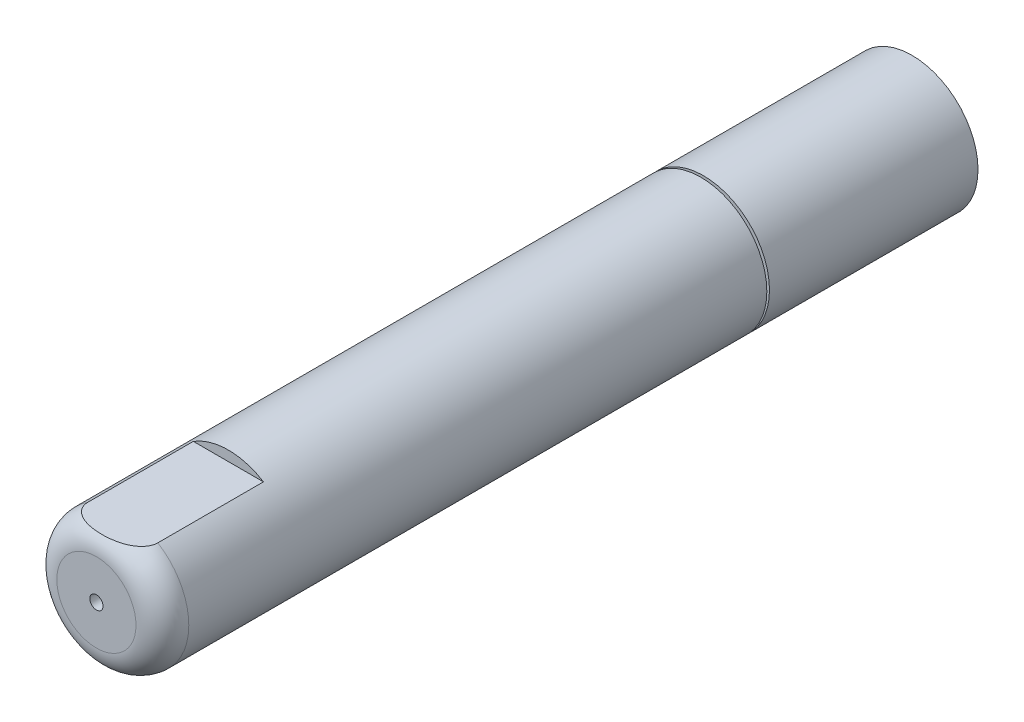
ISO-10303-21;
HEADER;
FILE_DESCRIPTION(('STEP AP214'),'2;1');
FILE_NAME('part.step','',(''),(''),'','','');
FILE_SCHEMA(('AUTOMOTIVE_DESIGN { 1 0 10303 214 1 1 1 1 }'));
ENDSEC;
DATA;
#1=APPLICATION_CONTEXT('core data for automotive mechanical design processes');
#2=APPLICATION_PROTOCOL_DEFINITION('international standard','automotive_design',2000,#1);
#3=PRODUCT_CONTEXT('',#1,'mechanical');
#4=PRODUCT('Part','Part','',(#3));
#5=PRODUCT_RELATED_PRODUCT_CATEGORY('part','',(#4));
#6=PRODUCT_DEFINITION_FORMATION('','',#4);
#7=PRODUCT_DEFINITION_CONTEXT('part definition',#1,'design');
#8=PRODUCT_DEFINITION('design','',#6,#7);
#9=PRODUCT_DEFINITION_SHAPE('','',#8);
#10=(LENGTH_UNIT() NAMED_UNIT(*) SI_UNIT(.MILLI.,.METRE.));
#11=(NAMED_UNIT(*) PLANE_ANGLE_UNIT() SI_UNIT($,.RADIAN.));
#12=(NAMED_UNIT(*) SI_UNIT($,.STERADIAN.) SOLID_ANGLE_UNIT());
#13=UNCERTAINTY_MEASURE_WITH_UNIT(LENGTH_MEASURE(1.E-05),#10,'distance_accuracy_value','');
#14=(GEOMETRIC_REPRESENTATION_CONTEXT(3) GLOBAL_UNCERTAINTY_ASSIGNED_CONTEXT((#13)) GLOBAL_UNIT_ASSIGNED_CONTEXT((#10,
#11,#12)) REPRESENTATION_CONTEXT('',''));
#15=CARTESIAN_POINT('',(0.,0.,0.));
#16=DIRECTION('',(0.,0.,1.));
#17=DIRECTION('',(1.,0.,0.));
#18=AXIS2_PLACEMENT_3D('',#15,#16,#17);
#19=CARTESIAN_POINT('',(0.,-6.62527908178398E-13,-47.7401670463173));
#20=DIRECTION('',(0.,0.,1.));
#21=DIRECTION('',(1.,0.,0.));
#22=AXIS2_PLACEMENT_3D('',#19,#20,#21);
#23=PLANE('',#22);
#24=CARTESIAN_POINT('',(0.,45.6333333333332,-47.7401670463173));
#25=DIRECTION('',(0.,0.,1.));
#26=DIRECTION('',(1.,0.,0.));
#27=AXIS2_PLACEMENT_3D('',#24,#25,#26);
#28=CIRCLE('',#27,2.5);
#29=CARTESIAN_POINT('',(2.5,45.6333333333332,-47.7401670463173));
#30=VERTEX_POINT('',#29);
#31=EDGE_CURVE('E87',#30,#30,#28,.T.);
#32=ORIENTED_EDGE('',*,*,#31,.T.);
#33=EDGE_LOOP('',(#32));
#34=FACE_BOUND('',#33,.T.);
#35=CARTESIAN_POINT('',(0.,45.6333333333332,-47.7401670463173));
#36=DIRECTION('',(0.,0.,1.));
#37=DIRECTION('',(1.,0.,0.));
#38=AXIS2_PLACEMENT_3D('',#35,#36,#37);
#39=CIRCLE('',#38,2.);
#40=CARTESIAN_POINT('',(2.,45.6333333333332,-47.7401670463173));
#41=VERTEX_POINT('',#40);
#42=EDGE_CURVE('E99',#41,#41,#39,.T.);
#43=ORIENTED_EDGE('',*,*,#42,.F.);
#44=EDGE_LOOP('',(#43));
#45=FACE_BOUND('',#44,.T.);
#46=ADVANCED_FACE('F37',(#34,#45),#23,.T.);
#47=CARTESIAN_POINT('',(0.,45.6333333333332,-15.9401670463172));
#48=DIRECTION('',(0.,0.,1.));
#49=DIRECTION('',(1.,0.,0.));
#50=AXIS2_PLACEMENT_3D('',#47,#48,#49);
#51=CYLINDRICAL_SURFACE('',#50,2.);
#52=CARTESIAN_POINT('',(0.,45.6333333333332,-47.6401670463173));
#53=DIRECTION('',(0.,0.,1.));
#54=DIRECTION('',(1.,0.,0.));
#55=AXIS2_PLACEMENT_3D('',#52,#53,#54);
#56=CIRCLE('',#55,2.);
#57=CARTESIAN_POINT('',(2.,45.6333333333332,-47.6401670463173));
#58=VERTEX_POINT('',#57);
#59=EDGE_CURVE('E96',#58,#58,#56,.T.);
#60=ORIENTED_EDGE('',*,*,#59,.F.);
#61=EDGE_LOOP('',(#60));
#62=FACE_BOUND('',#61,.T.);
#63=ORIENTED_EDGE('',*,*,#42,.T.);
#64=EDGE_LOOP('',(#63));
#65=FACE_BOUND('',#64,.T.);
#66=ADVANCED_FACE('F122',(#62,#65),#51,.T.);
#67=CARTESIAN_POINT('',(0.,0.,-47.6401670463173));
#68=DIRECTION('',(0.,0.,1.));
#69=DIRECTION('',(1.,0.,0.));
#70=AXIS2_PLACEMENT_3D('',#67,#68,#69);
#71=PLANE('',#70);
#72=CARTESIAN_POINT('',(0.,45.6333333333332,-47.6401670463173));
#73=DIRECTION('',(0.,0.,1.));
#74=DIRECTION('',(1.,0.,0.));
#75=AXIS2_PLACEMENT_3D('',#72,#73,#74);
#76=CIRCLE('',#75,2.5);
#77=CARTESIAN_POINT('',(2.5,45.6333333333332,-47.6401670463173));
#78=VERTEX_POINT('',#77);
#79=EDGE_CURVE('E93',#78,#78,#76,.T.);
#80=ORIENTED_EDGE('',*,*,#79,.F.);
#81=EDGE_LOOP('',(#80));
#82=FACE_BOUND('',#81,.T.);
#83=ORIENTED_EDGE('',*,*,#59,.T.);
#84=EDGE_LOOP('',(#83));
#85=FACE_BOUND('',#84,.T.);
#86=ADVANCED_FACE('F127',(#82,#85),#71,.F.);
#87=CARTESIAN_POINT('',(0.,45.6333333333332,-15.9401670463172));
#88=DIRECTION('',(0.,0.,1.));
#89=DIRECTION('',(1.,0.,0.));
#90=AXIS2_PLACEMENT_3D('',#87,#88,#89);
#91=CYLINDRICAL_SURFACE('',#90,2.5);
#92=DIRECTION('',(0.,0.,1.));
#93=VECTOR('',#92,1.);
#94=CARTESIAN_POINT('',(1.32834670312695,47.7512320646922,-29.7401670463173));
#95=LINE('',#94,#93);
#96=CARTESIAN_POINT('',(1.32834670312695,47.7512320646922,-29.7401670463173));
#97=VERTEX_POINT('',#96);
#98=CARTESIAN_POINT('',(1.32834670312695,47.7512320646922,-25.7401670463165));
#99=VERTEX_POINT('',#98);
#100=EDGE_CURVE('E74',#97,#99,#95,.T.);
#101=ORIENTED_EDGE('',*,*,#100,.T.);
#102=CARTESIAN_POINT('',(0.,45.6333333333332,-25.7401670463173));
#103=DIRECTION('',(0.,0.,1.));
#104=DIRECTION('',(1.,0.,0.));
#105=AXIS2_PLACEMENT_3D('',#102,#103,#104);
#106=CIRCLE('',#105,2.5);
#107=CARTESIAN_POINT('',(-1.32834670312695,47.7512320646922,-25.7401670463173));
#108=VERTEX_POINT('',#107);
#109=EDGE_CURVE('E50',#99,#108,#106,.F.);
#110=ORIENTED_EDGE('',*,*,#109,.T.);
#111=DIRECTION('',(0.,0.,1.));
#112=VECTOR('',#111,1.);
#113=CARTESIAN_POINT('',(-1.32834670312695,47.7512320646922,-29.7401670463173));
#114=LINE('',#113,#112);
#115=CARTESIAN_POINT('',(-1.32834670312695,47.7512320646922,-29.7401670463173));
#116=VERTEX_POINT('',#115);
#117=EDGE_CURVE('E56',#116,#108,#114,.T.);
#118=ORIENTED_EDGE('',*,*,#117,.F.);
#119=CARTESIAN_POINT('',(0.,45.6333333333332,-29.7401670463173));
#120=DIRECTION('',(0.,0.,1.));
#121=DIRECTION('',(1.,0.,0.));
#122=AXIS2_PLACEMENT_3D('',#119,#120,#121);
#123=CIRCLE('',#122,2.5);
#124=EDGE_CURVE('E68',#97,#116,#123,.T.);
#125=ORIENTED_EDGE('',*,*,#124,.F.);
#126=EDGE_LOOP('',(#101,#110,#118,#125));
#127=FACE_BOUND('',#126,.T.);
#128=ORIENTED_EDGE('',*,*,#79,.T.);
#129=EDGE_LOOP('',(#128));
#130=FACE_BOUND('',#129,.T.);
#131=ADVANCED_FACE('F77',(#127,#130),#91,.T.);
#132=CARTESIAN_POINT('',(0.,0.,-24.7401670463173));
#133=DIRECTION('',(0.,0.,1.));
#134=DIRECTION('',(1.,0.,0.));
#135=AXIS2_PLACEMENT_3D('',#132,#133,#134);
#136=PLANE('',#135);
#137=CARTESIAN_POINT('',(0.,45.6333333333332,-24.7401670463173));
#138=DIRECTION('',(0.,0.,1.));
#139=DIRECTION('',(1.,0.,0.));
#140=AXIS2_PLACEMENT_3D('',#137,#138,#139);
#141=CIRCLE('',#140,1.5);
#142=CARTESIAN_POINT('',(1.5,45.6333333333332,-24.7401670463173));
#143=VERTEX_POINT('',#142);
#144=EDGE_CURVE('E102',#143,#143,#141,.T.);
#145=ORIENTED_EDGE('',*,*,#144,.T.);
#146=EDGE_LOOP('',(#145));
#147=FACE_BOUND('',#146,.T.);
#148=CARTESIAN_POINT('',(0.,45.6333333333332,-24.7401670463173));
#149=DIRECTION('',(0.,0.,1.));
#150=DIRECTION('',(1.,0.,0.));
#151=AXIS2_PLACEMENT_3D('',#148,#149,#150);
#152=CIRCLE('',#151,0.25);
#153=CARTESIAN_POINT('',(0.25,45.6333333333332,-24.7401670463173));
#154=VERTEX_POINT('',#153);
#155=EDGE_CURVE('E81',#154,#154,#152,.T.);
#156=ORIENTED_EDGE('',*,*,#155,.F.);
#157=EDGE_LOOP('',(#156));
#158=FACE_BOUND('',#157,.T.);
#159=ADVANCED_FACE('F108',(#147,#158),#136,.T.);
#160=CARTESIAN_POINT('',(0.,0.,-55.6401670463173));
#161=DIRECTION('',(0.,0.,-1.));
#162=DIRECTION('',(-1.,0.,0.));
#163=AXIS2_PLACEMENT_3D('',#160,#161,#162);
#164=PLANE('',#163);
#165=CARTESIAN_POINT('',(0.,45.6333333333332,-55.6401670463173));
#166=DIRECTION('',(0.,0.,-1.));
#167=DIRECTION('',(-1.,0.,0.));
#168=AXIS2_PLACEMENT_3D('',#165,#166,#167);
#169=CIRCLE('',#168,0.25);
#170=CARTESIAN_POINT('',(-0.25,45.6333333333332,-55.6401670463173));
#171=VERTEX_POINT('',#170);
#172=EDGE_CURVE('E86',#171,#171,#169,.T.);
#173=ORIENTED_EDGE('',*,*,#172,.F.);
#174=EDGE_LOOP('',(#173));
#175=FACE_BOUND('',#174,.T.);
#176=CARTESIAN_POINT('',(0.,45.6333333333332,-55.6401670463173));
#177=DIRECTION('',(0.,0.,1.));
#178=DIRECTION('',(1.,0.,0.));
#179=AXIS2_PLACEMENT_3D('',#176,#177,#178);
#180=CIRCLE('',#179,2.5);
#181=CARTESIAN_POINT('',(2.5,45.6333333333332,-55.6401670463173));
#182=VERTEX_POINT('',#181);
#183=EDGE_CURVE('E90',#182,#182,#180,.T.);
#184=ORIENTED_EDGE('',*,*,#183,.F.);
#185=EDGE_LOOP('',(#184));
#186=FACE_BOUND('',#185,.T.);
#187=ADVANCED_FACE('F139',(#175,#186),#164,.T.);
#188=CARTESIAN_POINT('',(0.,45.6333333333332,-15.9401670463172));
#189=DIRECTION('',(0.,0.,1.));
#190=DIRECTION('',(1.,0.,0.));
#191=AXIS2_PLACEMENT_3D('',#188,#189,#190);
#192=CYLINDRICAL_SURFACE('',#191,2.5);
#193=ORIENTED_EDGE('',*,*,#183,.T.);
#194=EDGE_LOOP('',(#193));
#195=FACE_BOUND('',#194,.T.);
#196=ORIENTED_EDGE('',*,*,#31,.F.);
#197=EDGE_LOOP('',(#196));
#198=FACE_BOUND('',#197,.T.);
#199=ADVANCED_FACE('F118',(#195,#198),#192,.T.);
#200=CARTESIAN_POINT('',(0.,45.6333333333332,-74.7401670463173));
#201=DIRECTION('',(0.,0.,1.));
#202=DIRECTION('',(1.,0.,0.));
#203=AXIS2_PLACEMENT_3D('',#200,#201,#202);
#204=CYLINDRICAL_SURFACE('',#203,0.25);
#205=ORIENTED_EDGE('',*,*,#172,.T.);
#206=EDGE_LOOP('',(#205));
#207=FACE_BOUND('',#206,.T.);
#208=ORIENTED_EDGE('',*,*,#155,.T.);
#209=EDGE_LOOP('',(#208));
#210=FACE_BOUND('',#209,.T.);
#211=ADVANCED_FACE('F112',(#207,#210),#204,.F.);
#212=CARTESIAN_POINT('',(0.,45.6333333333332,-25.7401670463173));
#213=DIRECTION('',(0.,0.,1.));
#214=DIRECTION('',(1.,0.,0.));
#215=AXIS2_PLACEMENT_3D('',#212,#213,#214);
#216=TOROIDAL_SURFACE('',#215,1.5,1.);
#217=CARTESIAN_POINT('',(0.,47.7512320646922,-24.9539093545973));
#218=CARTESIAN_POINT('',(0.0685141496224069,47.7512320646922,-24.953913563322));
#219=CARTESIAN_POINT('',(0.137021109827275,47.7512320646922,-24.956499790419));
#220=CARTESIAN_POINT('',(0.273699709136835,47.7512320646922,-24.9671361280263));
#221=CARTESIAN_POINT('',(0.341870947582411,47.7512320646922,-24.9751916631748));
#222=CARTESIAN_POINT('',(0.476776802211017,47.7512320646922,-24.9975196797323));
#223=CARTESIAN_POINT('',(0.543517742171325,47.7512320646922,-25.0117529058205));
#224=CARTESIAN_POINT('',(0.674881731675962,47.7512320646922,-25.0477331085804));
#225=CARTESIAN_POINT('',(0.739509296908815,47.7512320646922,-25.0694627383757));
#226=CARTESIAN_POINT('',(0.844579949504387,47.7512320646922,-25.113639418727));
#227=CARTESIAN_POINT('',(0.886072861445503,47.7512320646922,-25.1335715949937));
#228=CARTESIAN_POINT('',(0.966428261463825,47.7512320646922,-25.1782997424781));
#229=CARTESIAN_POINT('',(1.00528959291544,47.7512320646922,-25.2030978339256));
#230=CARTESIAN_POINT('',(1.07945220384359,47.7512320646922,-25.2583867298678));
#231=CARTESIAN_POINT('',(1.11471095548794,47.7512320646922,-25.2889355908517));
#232=CARTESIAN_POINT('',(1.17926725667796,47.7512320646922,-25.3558154620351));
#233=CARTESIAN_POINT('',(1.20857758781601,47.7512320646922,-25.3921337690885));
#234=CARTESIAN_POINT('',(1.25148207825007,47.7512320646922,-25.4585870748113));
#235=CARTESIAN_POINT('',(1.26716079603568,47.7512320646922,-25.4873761621227));
#236=CARTESIAN_POINT('',(1.2935740090467,47.7512320646922,-25.5471511857708));
#237=CARTESIAN_POINT('',(1.30431199016453,47.7512320646922,-25.5781355553798));
#238=CARTESIAN_POINT('',(1.32017673917632,47.7512320646922,-25.6417040533042));
#239=CARTESIAN_POINT('',(1.32527315538572,47.7512320646922,-25.6742958588702));
#240=CARTESIAN_POINT('',(1.32935862273015,47.7512320646922,-25.7398621669932));
#241=CARTESIAN_POINT('',(1.3283489287078,47.7512320646922,-25.7728365895299));
#242=CARTESIAN_POINT('',(1.32064193781711,47.7512320646922,-25.8353404712764));
#243=CARTESIAN_POINT('',(1.31441915382964,47.7512320646922,-25.8649302462989));
#244=CARTESIAN_POINT('',(1.29730001484881,47.7512320646922,-25.9227126147264));
#245=CARTESIAN_POINT('',(1.28640326830428,47.7512320646922,-25.950905090855));
#246=CARTESIAN_POINT('',(1.25994646413886,47.7512320646922,-26.0065559646398));
#247=CARTESIAN_POINT('',(1.24419873804801,47.7512320646922,-26.0339243407825));
#248=CARTESIAN_POINT('',(1.20901432739253,47.7512320646922,-26.0861605066132));
#249=CARTESIAN_POINT('',(1.18957553742458,47.7512320646922,-26.111026856686));
#250=CARTESIAN_POINT('',(1.13622832333683,47.7512320646922,-26.1710734377758));
#251=CARTESIAN_POINT('',(1.10023980187056,47.7512320646922,-26.2044092441441));
#252=CARTESIAN_POINT('',(1.0234357170166,47.7512320646922,-26.264930927238));
#253=CARTESIAN_POINT('',(0.982609528811232,47.7512320646922,-26.2921028705493));
#254=CARTESIAN_POINT('',(0.874102956684638,47.7512320646922,-26.3545350702503));
#255=CARTESIAN_POINT('',(0.804161748187966,47.7512320646922,-26.3858339727984));
#256=CARTESIAN_POINT('',(0.660386620945495,47.7512320646922,-26.437687684449));
#257=CARTESIAN_POINT('',(0.58654068467472,47.7512320646922,-26.4582069101694));
#258=CARTESIAN_POINT('',(0.445974032467818,47.7512320646922,-26.4887257130085));
#259=CARTESIAN_POINT('',(0.379454093906918,47.7512320646922,-26.4996881398047));
#260=CARTESIAN_POINT('',(0.245687494523019,47.7512320646922,-26.5159950406737));
#261=CARTESIAN_POINT('',(0.178440209341214,47.7512320646922,-26.5213342240262));
#262=CARTESIAN_POINT('',(0.0437044974134565,47.7512320646922,-26.5269230914176));
#263=CARTESIAN_POINT('',(-0.0237840415013472,47.7512320646922,-26.5271699781731));
#264=CARTESIAN_POINT('',(-0.1585427541395,47.7512320646922,-26.5225891835213));
#265=CARTESIAN_POINT('',(-0.225813049672891,47.7512320646922,-26.5177651378373));
#266=CARTESIAN_POINT('',(-0.374938048284167,47.7512320646922,-26.5008524838629));
#267=CARTESIAN_POINT('',(-0.456642958213601,47.7512320646922,-26.4873652835866));
#268=CARTESIAN_POINT('',(-0.61762155360324,47.7512320646922,-26.4501491449787));
#269=CARTESIAN_POINT('',(-0.696901336151477,47.7512320646922,-26.4264486250633));
#270=CARTESIAN_POINT('',(-0.825867057022476,47.7512320646922,-26.375529083053));
#271=CARTESIAN_POINT('',(-0.876929534832077,47.7512320646922,-26.3518409702341));
#272=CARTESIAN_POINT('',(-0.975091540188782,47.7512320646922,-26.2972230186328));
#273=CARTESIAN_POINT('',(-1.02219599052907,47.7512320646922,-26.266302362109));
#274=CARTESIAN_POINT('',(-1.09780552429201,47.7512320646922,-26.2060087103429));
#275=CARTESIAN_POINT('',(-1.12784949112076,47.7512320646922,-26.1785771608332));
#276=CARTESIAN_POINT('',(-1.18325689748321,47.7512320646922,-26.1193165298589));
#277=CARTESIAN_POINT('',(-1.20862684911641,47.7512320646922,-26.0874936764685));
#278=CARTESIAN_POINT('',(-1.2490312479437,47.7512320646922,-26.0259877885638));
#279=CARTESIAN_POINT('',(-1.26510903497001,47.7512320646922,-25.9969935979362));
#280=CARTESIAN_POINT('',(-1.29224404331313,47.7512320646922,-25.9367271024201));
#281=CARTESIAN_POINT('',(-1.30330384285369,47.7512320646922,-25.9054559770193));
#282=CARTESIAN_POINT('',(-1.31970366254036,47.7512320646922,-25.8412428129531));
#283=CARTESIAN_POINT('',(-1.32501163559152,47.7512320646922,-25.8082924726389));
#284=CARTESIAN_POINT('',(-1.3293788844938,47.7512320646922,-25.7419803901301));
#285=CARTESIAN_POINT('',(-1.3284400304853,47.7512320646922,-25.7086187740461));
#286=CARTESIAN_POINT('',(-1.32077255153689,47.7512320646922,-25.6457132310476));
#287=CARTESIAN_POINT('',(-1.31458598137936,47.7512320646922,-25.6161010155598));
#288=CARTESIAN_POINT('',(-1.29753068075469,47.7512320646922,-25.5582689895489));
#289=CARTESIAN_POINT('',(-1.28666147987234,47.7512320646922,-25.5300493192378));
#290=CARTESIAN_POINT('',(-1.2602638162209,47.7512320646922,-25.474366743699));
#291=CARTESIAN_POINT('',(-1.24455119892142,47.7512320646922,-25.4469919355823));
#292=CARTESIAN_POINT('',(-1.20943628448073,47.7512320646922,-25.3947422869711));
#293=CARTESIAN_POINT('',(-1.19003231971534,47.7512320646922,-25.3698685841836));
#294=CARTESIAN_POINT('',(-1.13679871576545,47.7512320646922,-25.3098310523586));
#295=CARTESIAN_POINT('',(-1.10089338766925,47.7512320646922,-25.2765040867743));
#296=CARTESIAN_POINT('',(-1.02423706557268,47.7512320646922,-25.215971270324));
#297=CARTESIAN_POINT('',(-0.98347307032824,47.7512320646922,-25.1887824329513));
#298=CARTESIAN_POINT('',(-0.875101912909792,47.7512320646922,-25.1262904430359));
#299=CARTESIAN_POINT('',(-0.805228328160229,47.7512320646922,-25.0949484941498));
#300=CARTESIAN_POINT('',(-0.661727487286396,47.7512320646922,-25.0430671001978));
#301=CARTESIAN_POINT('',(-0.588095587738761,47.7512320646922,-25.0225413912709));
#302=CARTESIAN_POINT('',(-0.429469389404173,47.7512320646922,-24.9879405631758));
#303=CARTESIAN_POINT('',(-0.344228647004814,47.7512320646922,-24.975029844988));
#304=CARTESIAN_POINT('',(-0.172656543551831,47.7512320646922,-24.9579974618206));
#305=CARTESIAN_POINT('',(-0.0863225655121065,47.7512320646922,-24.9539040519276));
#306=CARTESIAN_POINT('',(0.,47.7512320646922,-24.9539093545973));
#307=B_SPLINE_CURVE_WITH_KNOTS('',3,(#217,#218,#219,#220,#221,#222,#223,#224,#225,#226,#227,
#228,#229,#230,#231,#232,#233,#234,#235,#236,#237,#238,#239,#240,#241,#242,#243,#244,#245,#246,
#247,#248,#249,#250,#251,#252,#253,#254,#255,#256,#257,#258,#259,#260,#261,#262,#263,#264,#265,
#266,#267,#268,#269,#270,#271,#272,#273,#274,#275,#276,#277,#278,#279,#280,#281,#282,#283,#284,
#285,#286,#287,#288,#289,#290,#291,#292,#293,#294,#295,#296,#297,#298,#299,#300,#301,#302,#303,
#304,#305,#306),.UNSPECIFIED.,.T.,.F.,(4,2,2,2,2,2,2,2,2,2,2,2,2,2,2,2,2,2,2,2,2,2,2,2,2,2,2,2,
2,2,2,2,2,2,2,2,2,2,2,2,2,2,2,2,4),(0.,0.205478636829246,0.411161372373598,0.615555832086707,
0.819480455401789,0.957315032792793,1.09520980288012,1.23457960873385,1.3736466986289,
1.4716034929344,1.56949106832439,1.66790275843217,1.76629422502912,1.85659506256297,
1.94690346633345,2.04127293778922,2.13569640070308,2.28202498341979,2.42868111697969,
2.65726540212802,2.88659956960186,3.08857844127019,3.29074717875026,3.49302696793673,
3.69516182677013,3.94310621926315,4.19036512006696,4.35879197190812,4.52700614279582,
4.64865050655543,4.77012408527176,4.86918094974449,4.96818686136444,5.06774160591603,
5.16726654766255,5.25761100272089,5.3479645358639,5.44229825610289,5.53667469472247,
5.68280377079619,5.82933304195689,6.05777947939426,6.28651533860541,6.54457690065968,
6.80346419892997),.UNSPECIFIED.);
#308=EDGE_CURVE('E11',#108,#99,#307,.T.);
#309=ORIENTED_EDGE('',*,*,#308,.F.);
#310=ORIENTED_EDGE('',*,*,#109,.F.);
#311=EDGE_LOOP('',(#309,#310));
#312=FACE_BOUND('',#311,.T.);
#313=ORIENTED_EDGE('',*,*,#144,.F.);
#314=EDGE_LOOP('',(#313));
#315=FACE_BOUND('',#314,.T.);
#316=ADVANCED_FACE('F39',(#312,#315),#216,.T.);
#317=CARTESIAN_POINT('',(0.,47.7512320646922,-29.7401670463173));
#318=DIRECTION('',(0.,-1.,0.));
#319=DIRECTION('',(0.,0.,-1.));
#320=AXIS2_PLACEMENT_3D('',#317,#318,#319);
#321=PLANE('',#320);
#322=ORIENTED_EDGE('',*,*,#308,.T.);
#323=ORIENTED_EDGE('',*,*,#100,.F.);
#324=DIRECTION('',(1.,0.,0.));
#325=VECTOR('',#324,1.);
#326=CARTESIAN_POINT('',(0.,47.7512320646922,-29.7401670463173));
#327=LINE('',#326,#325);
#328=EDGE_CURVE('E70',#116,#97,#327,.T.);
#329=ORIENTED_EDGE('',*,*,#328,.F.);
#330=ORIENTED_EDGE('',*,*,#117,.T.);
#331=EDGE_LOOP('',(#322,#323,#329,#330));
#332=FACE_BOUND('',#331,.T.);
#333=ADVANCED_FACE('F73',(#332),#321,.F.);
#334=CARTESIAN_POINT('',(0.,0.,-29.7401670463173));
#335=DIRECTION('',(0.,0.,1.));
#336=DIRECTION('',(1.,0.,0.));
#337=AXIS2_PLACEMENT_3D('',#334,#335,#336);
#338=PLANE('',#337);
#339=ORIENTED_EDGE('',*,*,#124,.T.);
#340=ORIENTED_EDGE('',*,*,#328,.T.);
#341=EDGE_LOOP('',(#339,#340));
#342=FACE_BOUND('',#341,.T.);
#343=ADVANCED_FACE('F69',(#342),#338,.T.);
#344=CLOSED_SHELL('',(#46,#66,#86,#131,#159,#187,#199,#211,#316,#333,#343));
#345=MANIFOLD_SOLID_BREP('B2',#344);
#346=ADVANCED_BREP_SHAPE_REPRESENTATION('',(#18,#345),#14);
#347=SHAPE_DEFINITION_REPRESENTATION(#9,#346);
ENDSEC;
END-ISO-10303-21;
